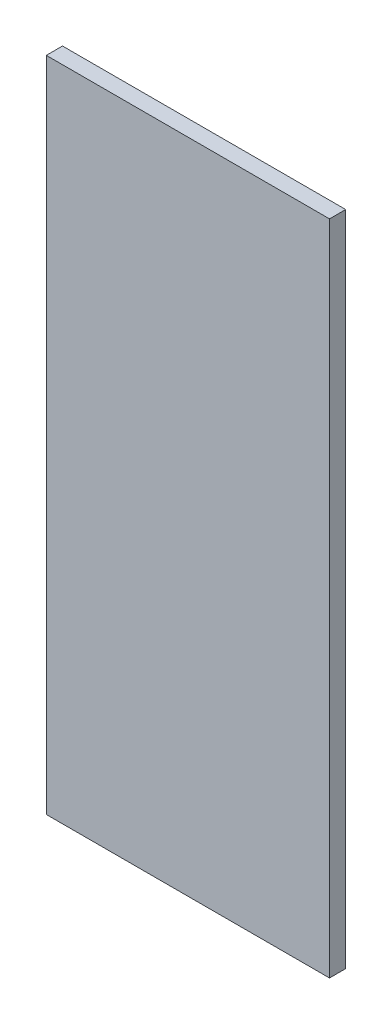
ISO-10303-21;
HEADER;
FILE_DESCRIPTION(('STEP AP214'),'2;1');
FILE_NAME('part.step','',(''),(''),'','','');
FILE_SCHEMA(('AUTOMOTIVE_DESIGN { 1 0 10303 214 1 1 1 1 }'));
ENDSEC;
DATA;
#1=APPLICATION_CONTEXT('core data for automotive mechanical design processes');
#2=APPLICATION_PROTOCOL_DEFINITION('international standard','automotive_design',2000,#1);
#3=PRODUCT_CONTEXT('',#1,'mechanical');
#4=PRODUCT('Part','Part','',(#3));
#5=PRODUCT_RELATED_PRODUCT_CATEGORY('part','',(#4));
#6=PRODUCT_DEFINITION_FORMATION('','',#4);
#7=PRODUCT_DEFINITION_CONTEXT('part definition',#1,'design');
#8=PRODUCT_DEFINITION('design','',#6,#7);
#9=PRODUCT_DEFINITION_SHAPE('','',#8);
#10=(LENGTH_UNIT() NAMED_UNIT(*) SI_UNIT(.MILLI.,.METRE.));
#11=(NAMED_UNIT(*) PLANE_ANGLE_UNIT() SI_UNIT($,.RADIAN.));
#12=(NAMED_UNIT(*) SI_UNIT($,.STERADIAN.) SOLID_ANGLE_UNIT());
#13=UNCERTAINTY_MEASURE_WITH_UNIT(LENGTH_MEASURE(1.E-05),#10,'distance_accuracy_value','');
#14=(GEOMETRIC_REPRESENTATION_CONTEXT(3) GLOBAL_UNCERTAINTY_ASSIGNED_CONTEXT((#13)) GLOBAL_UNIT_ASSIGNED_CONTEXT((#10,
#11,#12)) REPRESENTATION_CONTEXT('',''));
#15=CARTESIAN_POINT('',(0.,0.,0.));
#16=DIRECTION('',(0.,0.,1.));
#17=DIRECTION('',(1.,0.,0.));
#18=AXIS2_PLACEMENT_3D('',#15,#16,#17);
#19=CARTESIAN_POINT('',(14.,-32.5,-1.6));
#20=DIRECTION('',(1.,0.,0.));
#21=DIRECTION('',(0.,0.,-1.));
#22=AXIS2_PLACEMENT_3D('',#19,#20,#21);
#23=PLANE('',#22);
#24=DIRECTION('',(0.,1.,0.));
#25=VECTOR('',#24,1.);
#26=CARTESIAN_POINT('',(14.,-32.5,0.));
#27=LINE('',#26,#25);
#28=CARTESIAN_POINT('',(14.,-32.5,0.));
#29=VERTEX_POINT('',#28);
#30=CARTESIAN_POINT('',(14.,32.5,0.));
#31=VERTEX_POINT('',#30);
#32=EDGE_CURVE('E104',#29,#31,#27,.T.);
#33=ORIENTED_EDGE('',*,*,#32,.F.);
#34=DIRECTION('',(0.,0.,1.));
#35=VECTOR('',#34,1.);
#36=CARTESIAN_POINT('',(14.,-32.5,-1.6));
#37=LINE('',#36,#35);
#38=CARTESIAN_POINT('',(14.,-32.5,-1.6));
#39=VERTEX_POINT('',#38);
#40=EDGE_CURVE('E11',#39,#29,#37,.T.);
#41=ORIENTED_EDGE('',*,*,#40,.F.);
#42=DIRECTION('',(0.,1.,0.));
#43=VECTOR('',#42,1.);
#44=CARTESIAN_POINT('',(14.,-32.5,-1.6));
#45=LINE('',#44,#43);
#46=CARTESIAN_POINT('',(14.,32.5,-1.6));
#47=VERTEX_POINT('',#46);
#48=EDGE_CURVE('E100',#39,#47,#45,.T.);
#49=ORIENTED_EDGE('',*,*,#48,.T.);
#50=DIRECTION('',(0.,0.,1.));
#51=VECTOR('',#50,1.);
#52=CARTESIAN_POINT('',(14.,32.5,-1.6));
#53=LINE('',#52,#51);
#54=EDGE_CURVE('E45',#47,#31,#53,.T.);
#55=ORIENTED_EDGE('',*,*,#54,.T.);
#56=EDGE_LOOP('',(#33,#41,#49,#55));
#57=FACE_BOUND('',#56,.T.);
#58=ADVANCED_FACE('F39',(#57),#23,.T.);
#59=CARTESIAN_POINT('',(-14.,-32.5,-1.6));
#60=DIRECTION('',(0.,-1.,0.));
#61=DIRECTION('',(0.,0.,-1.));
#62=AXIS2_PLACEMENT_3D('',#59,#60,#61);
#63=PLANE('',#62);
#64=DIRECTION('',(1.,0.,0.));
#65=VECTOR('',#64,1.);
#66=CARTESIAN_POINT('',(-14.,-32.5,0.));
#67=LINE('',#66,#65);
#68=CARTESIAN_POINT('',(-14.,-32.5,0.));
#69=VERTEX_POINT('',#68);
#70=EDGE_CURVE('E98',#69,#29,#67,.T.);
#71=ORIENTED_EDGE('',*,*,#70,.F.);
#72=DIRECTION('',(0.,0.,1.));
#73=VECTOR('',#72,1.);
#74=CARTESIAN_POINT('',(-14.,-32.5,-1.6));
#75=LINE('',#74,#73);
#76=CARTESIAN_POINT('',(-14.,-32.5,-1.6));
#77=VERTEX_POINT('',#76);
#78=EDGE_CURVE('E48',#77,#69,#75,.T.);
#79=ORIENTED_EDGE('',*,*,#78,.F.);
#80=DIRECTION('',(1.,0.,0.));
#81=VECTOR('',#80,1.);
#82=CARTESIAN_POINT('',(-14.,-32.5,-1.6));
#83=LINE('',#82,#81);
#84=EDGE_CURVE('E92',#77,#39,#83,.T.);
#85=ORIENTED_EDGE('',*,*,#84,.T.);
#86=ORIENTED_EDGE('',*,*,#40,.T.);
#87=EDGE_LOOP('',(#71,#79,#85,#86));
#88=FACE_BOUND('',#87,.T.);
#89=ADVANCED_FACE('F111',(#88),#63,.T.);
#90=CARTESIAN_POINT('',(-14.,-32.5,-1.6));
#91=DIRECTION('',(-1.,0.,0.));
#92=DIRECTION('',(0.,0.,1.));
#93=AXIS2_PLACEMENT_3D('',#90,#91,#92);
#94=PLANE('',#93);
#95=DIRECTION('',(0.,-1.,0.));
#96=VECTOR('',#95,1.);
#97=CARTESIAN_POINT('',(-14.,-32.5,0.));
#98=LINE('',#97,#96);
#99=CARTESIAN_POINT('',(-14.,32.5,0.));
#100=VERTEX_POINT('',#99);
#101=EDGE_CURVE('E87',#100,#69,#98,.T.);
#102=ORIENTED_EDGE('',*,*,#101,.F.);
#103=DIRECTION('',(0.,0.,1.));
#104=VECTOR('',#103,1.);
#105=CARTESIAN_POINT('',(-14.,32.5,-1.6));
#106=LINE('',#105,#104);
#107=CARTESIAN_POINT('',(-14.,32.5,-1.6));
#108=VERTEX_POINT('',#107);
#109=EDGE_CURVE('E84',#108,#100,#106,.T.);
#110=ORIENTED_EDGE('',*,*,#109,.F.);
#111=DIRECTION('',(0.,-1.,0.));
#112=VECTOR('',#111,1.);
#113=CARTESIAN_POINT('',(-14.,-32.5,-1.6));
#114=LINE('',#113,#112);
#115=EDGE_CURVE('E90',#108,#77,#114,.T.);
#116=ORIENTED_EDGE('',*,*,#115,.T.);
#117=ORIENTED_EDGE('',*,*,#78,.T.);
#118=EDGE_LOOP('',(#102,#110,#116,#117));
#119=FACE_BOUND('',#118,.T.);
#120=ADVANCED_FACE('F86',(#119),#94,.T.);
#121=CARTESIAN_POINT('',(-14.,32.5,-1.6));
#122=DIRECTION('',(0.,1.,0.));
#123=DIRECTION('',(0.,0.,1.));
#124=AXIS2_PLACEMENT_3D('',#121,#122,#123);
#125=PLANE('',#124);
#126=DIRECTION('',(-1.,0.,0.));
#127=VECTOR('',#126,1.);
#128=CARTESIAN_POINT('',(-14.,32.5,0.));
#129=LINE('',#128,#127);
#130=EDGE_CURVE('E107',#31,#100,#129,.T.);
#131=ORIENTED_EDGE('',*,*,#130,.F.);
#132=ORIENTED_EDGE('',*,*,#54,.F.);
#133=DIRECTION('',(-1.,0.,0.));
#134=VECTOR('',#133,1.);
#135=CARTESIAN_POINT('',(-14.,32.5,-1.6));
#136=LINE('',#135,#134);
#137=EDGE_CURVE('E93',#47,#108,#136,.T.);
#138=ORIENTED_EDGE('',*,*,#137,.T.);
#139=ORIENTED_EDGE('',*,*,#109,.T.);
#140=EDGE_LOOP('',(#131,#132,#138,#139));
#141=FACE_BOUND('',#140,.T.);
#142=ADVANCED_FACE('F96',(#141),#125,.T.);
#143=CARTESIAN_POINT('',(0.,0.,-1.6));
#144=DIRECTION('',(0.,0.,-1.));
#145=DIRECTION('',(-1.,0.,0.));
#146=AXIS2_PLACEMENT_3D('',#143,#144,#145);
#147=PLANE('',#146);
#148=ORIENTED_EDGE('',*,*,#48,.F.);
#149=ORIENTED_EDGE('',*,*,#84,.F.);
#150=ORIENTED_EDGE('',*,*,#115,.F.);
#151=ORIENTED_EDGE('',*,*,#137,.F.);
#152=EDGE_LOOP('',(#148,#149,#150,#151));
#153=FACE_BOUND('',#152,.T.);
#154=ADVANCED_FACE('F95',(#153),#147,.T.);
#155=CARTESIAN_POINT('',(0.,0.,0.));
#156=DIRECTION('',(0.,0.,-1.));
#157=DIRECTION('',(-1.,0.,0.));
#158=AXIS2_PLACEMENT_3D('',#155,#156,#157);
#159=PLANE('',#158);
#160=ORIENTED_EDGE('',*,*,#32,.T.);
#161=ORIENTED_EDGE('',*,*,#130,.T.);
#162=ORIENTED_EDGE('',*,*,#101,.T.);
#163=ORIENTED_EDGE('',*,*,#70,.T.);
#164=EDGE_LOOP('',(#160,#161,#162,#163));
#165=FACE_BOUND('',#164,.T.);
#166=ADVANCED_FACE('F115',(#165),#159,.F.);
#167=CLOSED_SHELL('',(#58,#89,#120,#142,#154,#166));
#168=MANIFOLD_SOLID_BREP('B2',#167);
#169=ADVANCED_BREP_SHAPE_REPRESENTATION('',(#18,#168),#14);
#170=SHAPE_DEFINITION_REPRESENTATION(#9,#169);
ENDSEC;
END-ISO-10303-21;
